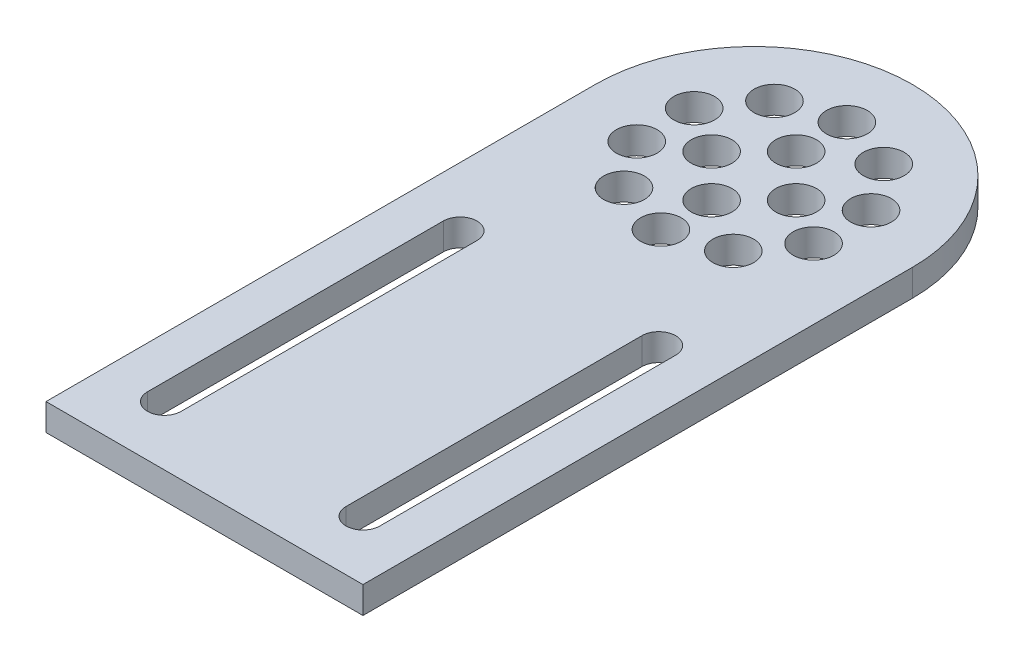
ISO-10303-21;
HEADER;
FILE_DESCRIPTION(('STEP AP214'),'2;1');
FILE_NAME('part.step','',(''),(''),'','','');
FILE_SCHEMA(('AUTOMOTIVE_DESIGN { 1 0 10303 214 1 1 1 1 }'));
ENDSEC;
DATA;
#1=APPLICATION_CONTEXT('core data for automotive mechanical design processes');
#2=APPLICATION_PROTOCOL_DEFINITION('international standard','automotive_design',2000,#1);
#3=PRODUCT_CONTEXT('',#1,'mechanical');
#4=PRODUCT('Part','Part','',(#3));
#5=PRODUCT_RELATED_PRODUCT_CATEGORY('part','',(#4));
#6=PRODUCT_DEFINITION_FORMATION('','',#4);
#7=PRODUCT_DEFINITION_CONTEXT('part definition',#1,'design');
#8=PRODUCT_DEFINITION('design','',#6,#7);
#9=PRODUCT_DEFINITION_SHAPE('','',#8);
#10=(LENGTH_UNIT() NAMED_UNIT(*) SI_UNIT(.MILLI.,.METRE.));
#11=(NAMED_UNIT(*) PLANE_ANGLE_UNIT() SI_UNIT($,.RADIAN.));
#12=(NAMED_UNIT(*) SI_UNIT($,.STERADIAN.) SOLID_ANGLE_UNIT());
#13=UNCERTAINTY_MEASURE_WITH_UNIT(LENGTH_MEASURE(1.E-05),#10,'distance_accuracy_value','');
#14=(GEOMETRIC_REPRESENTATION_CONTEXT(3) GLOBAL_UNCERTAINTY_ASSIGNED_CONTEXT((#13)) GLOBAL_UNIT_ASSIGNED_CONTEXT((#10,
#11,#12)) REPRESENTATION_CONTEXT('',''));
#15=CARTESIAN_POINT('',(0.,0.,0.));
#16=DIRECTION('',(0.,0.,1.));
#17=DIRECTION('',(1.,0.,0.));
#18=AXIS2_PLACEMENT_3D('',#15,#16,#17);
#19=CARTESIAN_POINT('',(0.,6.35,0.));
#20=DIRECTION('',(0.,1.,0.));
#21=DIRECTION('',(0.,0.,1.));
#22=AXIS2_PLACEMENT_3D('',#19,#20,#21);
#23=PLANE('',#22);
#24=CARTESIAN_POINT('',(-23.5,6.35,116.));
#25=DIRECTION('',(0.,1.,0.));
#26=DIRECTION('',(0.,0.,1.));
#27=AXIS2_PLACEMENT_3D('',#24,#25,#26);
#28=CIRCLE('',#27,4.);
#29=CARTESIAN_POINT('',(-27.5,6.35,116.));
#30=VERTEX_POINT('',#29);
#31=CARTESIAN_POINT('',(-19.5,6.35,116.));
#32=VERTEX_POINT('',#31);
#33=EDGE_CURVE('E170',#30,#32,#28,.T.);
#34=ORIENTED_EDGE('',*,*,#33,.F.);
#35=DIRECTION('',(0.,0.,1.));
#36=VECTOR('',#35,1.);
#37=CARTESIAN_POINT('',(-27.5,6.35,116.));
#38=LINE('',#37,#36);
#39=CARTESIAN_POINT('',(-27.5,6.35,46.));
#40=VERTEX_POINT('',#39);
#41=EDGE_CURVE('E181',#40,#30,#38,.T.);
#42=ORIENTED_EDGE('',*,*,#41,.F.);
#43=CARTESIAN_POINT('',(-23.5,6.35,46.));
#44=DIRECTION('',(0.,1.,0.));
#45=DIRECTION('',(0.,0.,1.));
#46=AXIS2_PLACEMENT_3D('',#43,#44,#45);
#47=CIRCLE('',#46,4.00000000000001);
#48=CARTESIAN_POINT('',(-19.5,6.35,46.));
#49=VERTEX_POINT('',#48);
#50=EDGE_CURVE('E200',#49,#40,#47,.T.);
#51=ORIENTED_EDGE('',*,*,#50,.F.);
#52=DIRECTION('',(0.,0.,-1.));
#53=VECTOR('',#52,1.);
#54=CARTESIAN_POINT('',(-19.5,6.35,116.));
#55=LINE('',#54,#53);
#56=EDGE_CURVE('E196',#32,#49,#55,.T.);
#57=ORIENTED_EDGE('',*,*,#56,.F.);
#58=EDGE_LOOP('',(#34,#42,#51,#57));
#59=FACE_BOUND('',#58,.T.);
#60=CARTESIAN_POINT('',(5.84358922609454E-13,6.35,10.));
#61=DIRECTION('',(0.,1.,0.));
#62=DIRECTION('',(0.,0.,1.));
#63=AXIS2_PLACEMENT_3D('',#60,#61,#62);
#64=CIRCLE('',#63,4.825);
#65=CARTESIAN_POINT('',(5.84358922609454E-13,6.35,14.825));
#66=VERTEX_POINT('',#65);
#67=EDGE_CURVE('E228',#66,#66,#64,.T.);
#68=ORIENTED_EDGE('',*,*,#67,.F.);
#69=EDGE_LOOP('',(#68));
#70=FACE_BOUND('',#69,.T.);
#71=CARTESIAN_POINT('',(-12.9312755504338,6.35,-17.7983738762469));
#72=DIRECTION('',(0.,1.,0.));
#73=DIRECTION('',(0.,0.,1.));
#74=AXIS2_PLACEMENT_3D('',#71,#72,#73);
#75=CIRCLE('',#74,4.825);
#76=CARTESIAN_POINT('',(-12.9312755504338,6.35,-12.9733738762469));
#77=VERTEX_POINT('',#76);
#78=EDGE_CURVE('E244',#77,#77,#75,.T.);
#79=ORIENTED_EDGE('',*,*,#78,.F.);
#80=EDGE_LOOP('',(#79));
#81=FACE_BOUND('',#80,.T.);
#82=CARTESIAN_POINT('',(-20.9232433584891,6.35,6.79837387625193));
#83=DIRECTION('',(0.,1.,0.));
#84=DIRECTION('',(0.,0.,1.));
#85=AXIS2_PLACEMENT_3D('',#82,#83,#84);
#86=CIRCLE('',#85,4.825);
#87=CARTESIAN_POINT('',(-20.9232433584891,6.35,11.6233738762519));
#88=VERTEX_POINT('',#87);
#89=EDGE_CURVE('E260',#88,#88,#86,.T.);
#90=ORIENTED_EDGE('',*,*,#89,.F.);
#91=EDGE_LOOP('',(#90));
#92=FACE_BOUND('',#91,.T.);
#93=CARTESIAN_POINT('',(6.48527081483162E-12,6.35,22.));
#94=DIRECTION('',(0.,1.,0.));
#95=DIRECTION('',(0.,0.,1.));
#96=AXIS2_PLACEMENT_3D('',#93,#94,#95);
#97=CIRCLE('',#96,4.825);
#98=CARTESIAN_POINT('',(6.48527081483162E-12,6.35,26.825));
#99=VERTEX_POINT('',#98);
#100=EDGE_CURVE('E276',#99,#99,#97,.T.);
#101=ORIENTED_EDGE('',*,*,#100,.F.);
#102=EDGE_LOOP('',(#101));
#103=FACE_BOUND('',#102,.T.);
#104=CARTESIAN_POINT('',(20.9232433584976,6.35,6.79837387624576));
#105=DIRECTION('',(0.,1.,0.));
#106=DIRECTION('',(0.,0.,1.));
#107=AXIS2_PLACEMENT_3D('',#104,#105,#106);
#108=CIRCLE('',#107,4.825);
#109=CARTESIAN_POINT('',(20.9232433584976,6.35,11.6233738762458));
#110=VERTEX_POINT('',#109);
#111=EDGE_CURVE('E292',#110,#110,#108,.T.);
#112=ORIENTED_EDGE('',*,*,#111,.F.);
#113=EDGE_LOOP('',(#112));
#114=FACE_BOUND('',#113,.T.);
#115=CARTESIAN_POINT('',(12.931275550435,6.35,-17.7983738762507));
#116=DIRECTION('',(0.,1.,0.));
#117=DIRECTION('',(0.,0.,1.));
#118=AXIS2_PLACEMENT_3D('',#115,#116,#117);
#119=CIRCLE('',#118,4.82500000000008);
#120=CARTESIAN_POINT('',(12.931275550435,6.35,-12.9733738762507));
#121=VERTEX_POINT('',#120);
#122=EDGE_CURVE('E308',#121,#121,#119,.T.);
#123=ORIENTED_EDGE('',*,*,#122,.F.);
#124=EDGE_LOOP('',(#123));
#125=FACE_BOUND('',#124,.T.);
#126=CARTESIAN_POINT('',(0.,6.35,-22.));
#127=DIRECTION('',(0.,1.,0.));
#128=DIRECTION('',(0.,0.,1.));
#129=AXIS2_PLACEMENT_3D('',#126,#127,#128);
#130=CIRCLE('',#129,4.825);
#131=CARTESIAN_POINT('',(0.,6.35,-17.175));
#132=VERTEX_POINT('',#131);
#133=EDGE_CURVE('E324',#132,#132,#130,.T.);
#134=ORIENTED_EDGE('',*,*,#133,.F.);
#135=EDGE_LOOP('',(#134));
#136=FACE_BOUND('',#135,.T.);
#137=CARTESIAN_POINT('',(0.,6.35,0.));
#138=DIRECTION('',(0.,1.,0.));
#139=DIRECTION('',(0.,0.,1.));
#140=AXIS2_PLACEMENT_3D('',#137,#138,#139);
#141=CIRCLE('',#140,37.5);
#142=CARTESIAN_POINT('',(37.5,6.35,0.));
#143=VERTEX_POINT('',#142);
#144=CARTESIAN_POINT('',(-37.5,6.35,0.));
#145=VERTEX_POINT('',#144);
#146=EDGE_CURVE('E332',#143,#145,#141,.T.);
#147=ORIENTED_EDGE('',*,*,#146,.T.);
#148=DIRECTION('',(0.,0.,1.));
#149=VECTOR('',#148,1.);
#150=CARTESIAN_POINT('',(-37.5,6.35,0.));
#151=LINE('',#150,#149);
#152=CARTESIAN_POINT('',(-37.5,6.35,130.));
#153=VERTEX_POINT('',#152);
#154=EDGE_CURVE('E336',#145,#153,#151,.T.);
#155=ORIENTED_EDGE('',*,*,#154,.T.);
#156=DIRECTION('',(1.,0.,0.));
#157=VECTOR('',#156,1.);
#158=CARTESIAN_POINT('',(-37.5,6.35,130.));
#159=LINE('',#158,#157);
#160=CARTESIAN_POINT('',(37.5,6.35,130.));
#161=VERTEX_POINT('',#160);
#162=EDGE_CURVE('E340',#153,#161,#159,.T.);
#163=ORIENTED_EDGE('',*,*,#162,.T.);
#164=DIRECTION('',(0.,0.,-1.));
#165=VECTOR('',#164,1.);
#166=CARTESIAN_POINT('',(37.5,6.35,130.));
#167=LINE('',#166,#165);
#168=EDGE_CURVE('E343',#161,#143,#167,.T.);
#169=ORIENTED_EDGE('',*,*,#168,.T.);
#170=EDGE_LOOP('',(#147,#155,#163,#169));
#171=FACE_BOUND('',#170,.T.);
#172=CARTESIAN_POINT('',(0.,6.35,-10.));
#173=DIRECTION('',(0.,1.,0.));
#174=DIRECTION('',(0.,0.,1.));
#175=AXIS2_PLACEMENT_3D('',#172,#173,#174);
#176=CIRCLE('',#175,4.825);
#177=CARTESIAN_POINT('',(0.,6.35,-5.175));
#178=VERTEX_POINT('',#177);
#179=EDGE_CURVE('E316',#178,#178,#176,.T.);
#180=ORIENTED_EDGE('',*,*,#179,.F.);
#181=EDGE_LOOP('',(#180));
#182=FACE_BOUND('',#181,.T.);
#183=CARTESIAN_POINT('',(20.9232433584956,6.35,-6.79837387625193));
#184=DIRECTION('',(0.,1.,0.));
#185=DIRECTION('',(0.,0.,1.));
#186=AXIS2_PLACEMENT_3D('',#183,#184,#185);
#187=CIRCLE('',#186,4.825);
#188=CARTESIAN_POINT('',(20.9232433584956,6.35,-1.97337387625193));
#189=VERTEX_POINT('',#188);
#190=EDGE_CURVE('E300',#189,#189,#187,.T.);
#191=ORIENTED_EDGE('',*,*,#190,.F.);
#192=EDGE_LOOP('',(#191));
#193=FACE_BOUND('',#192,.T.);
#194=CARTESIAN_POINT('',(12.9312755504403,6.35,17.7983738762469));
#195=DIRECTION('',(0.,1.,0.));
#196=DIRECTION('',(0.,0.,1.));
#197=AXIS2_PLACEMENT_3D('',#194,#195,#196);
#198=CIRCLE('',#197,4.825);
#199=CARTESIAN_POINT('',(12.9312755504403,6.35,22.6233738762469));
#200=VERTEX_POINT('',#199);
#201=EDGE_CURVE('E284',#200,#200,#198,.T.);
#202=ORIENTED_EDGE('',*,*,#201,.F.);
#203=EDGE_LOOP('',(#202));
#204=FACE_BOUND('',#203,.T.);
#205=CARTESIAN_POINT('',(-12.9312755504285,6.35,17.7983738762508));
#206=DIRECTION('',(0.,1.,0.));
#207=DIRECTION('',(0.,0.,1.));
#208=AXIS2_PLACEMENT_3D('',#205,#206,#207);
#209=CIRCLE('',#208,4.825);
#210=CARTESIAN_POINT('',(-12.9312755504285,6.35,22.6233738762508));
#211=VERTEX_POINT('',#210);
#212=EDGE_CURVE('E268',#211,#211,#209,.T.);
#213=ORIENTED_EDGE('',*,*,#212,.F.);
#214=EDGE_LOOP('',(#213));
#215=FACE_BOUND('',#214,.T.);
#216=CARTESIAN_POINT('',(-20.9232433584911,6.35,-6.79837387624576));
#217=DIRECTION('',(0.,1.,0.));
#218=DIRECTION('',(0.,0.,1.));
#219=AXIS2_PLACEMENT_3D('',#216,#217,#218);
#220=CIRCLE('',#219,4.825);
#221=CARTESIAN_POINT('',(-20.9232433584911,6.35,-1.97337387624576));
#222=VERTEX_POINT('',#221);
#223=EDGE_CURVE('E252',#222,#222,#220,.T.);
#224=ORIENTED_EDGE('',*,*,#223,.F.);
#225=EDGE_LOOP('',(#224));
#226=FACE_BOUND('',#225,.T.);
#227=CARTESIAN_POINT('',(10.0000000000003,6.35,-2.92179461304727E-13));
#228=DIRECTION('',(0.,1.,0.));
#229=DIRECTION('',(0.,0.,1.));
#230=AXIS2_PLACEMENT_3D('',#227,#228,#229);
#231=CIRCLE('',#230,4.825);
#232=CARTESIAN_POINT('',(10.0000000000003,6.35,4.82499999999971));
#233=VERTEX_POINT('',#232);
#234=EDGE_CURVE('E236',#233,#233,#231,.T.);
#235=ORIENTED_EDGE('',*,*,#234,.F.);
#236=EDGE_LOOP('',(#235));
#237=FACE_BOUND('',#236,.T.);
#238=CARTESIAN_POINT('',(-9.99999999999971,6.35,2.93404108103874E-13));
#239=DIRECTION('',(0.,1.,0.));
#240=DIRECTION('',(0.,0.,1.));
#241=AXIS2_PLACEMENT_3D('',#238,#239,#240);
#242=CIRCLE('',#241,4.825);
#243=CARTESIAN_POINT('',(-9.99999999999971,6.35,4.82500000000029));
#244=VERTEX_POINT('',#243);
#245=EDGE_CURVE('E220',#244,#244,#242,.T.);
#246=ORIENTED_EDGE('',*,*,#245,.F.);
#247=EDGE_LOOP('',(#246));
#248=FACE_BOUND('',#247,.T.);
#249=DIRECTION('',(0.,0.,1.));
#250=VECTOR('',#249,1.);
#251=CARTESIAN_POINT('',(27.5,6.35,116.));
#252=LINE('',#251,#250);
#253=CARTESIAN_POINT('',(27.5,6.35,46.));
#254=VERTEX_POINT('',#253);
#255=CARTESIAN_POINT('',(27.5,6.35,116.));
#256=VERTEX_POINT('',#255);
#257=EDGE_CURVE('E161',#254,#256,#252,.T.);
#258=ORIENTED_EDGE('',*,*,#257,.T.);
#259=CARTESIAN_POINT('',(23.5,6.35,116.));
#260=DIRECTION('',(0.,-1.,0.));
#261=DIRECTION('',(0.,0.,1.));
#262=AXIS2_PLACEMENT_3D('',#259,#260,#261);
#263=CIRCLE('',#262,4.);
#264=CARTESIAN_POINT('',(19.5,6.35,116.));
#265=VERTEX_POINT('',#264);
#266=EDGE_CURVE('E55',#256,#265,#263,.T.);
#267=ORIENTED_EDGE('',*,*,#266,.T.);
#268=DIRECTION('',(0.,0.,-1.));
#269=VECTOR('',#268,1.);
#270=CARTESIAN_POINT('',(19.5,6.35,116.));
#271=LINE('',#270,#269);
#272=CARTESIAN_POINT('',(19.5,6.35,46.));
#273=VERTEX_POINT('',#272);
#274=EDGE_CURVE('E148',#265,#273,#271,.T.);
#275=ORIENTED_EDGE('',*,*,#274,.T.);
#276=CARTESIAN_POINT('',(23.5,6.35,46.));
#277=DIRECTION('',(0.,-1.,0.));
#278=DIRECTION('',(0.,0.,1.));
#279=AXIS2_PLACEMENT_3D('',#276,#277,#278);
#280=CIRCLE('',#279,4.00000000000001);
#281=EDGE_CURVE('E152',#273,#254,#280,.T.);
#282=ORIENTED_EDGE('',*,*,#281,.T.);
#283=EDGE_LOOP('',(#258,#267,#275,#282));
#284=FACE_BOUND('',#283,.T.);
#285=ADVANCED_FACE('F39',(#59,#70,#81,#92,#103,#114,#125,#136,#171,#182,#193,#204,#215,#226,
#237,#248,#284),#23,.T.);
#286=CARTESIAN_POINT('',(0.,0.,0.));
#287=DIRECTION('',(0.,1.,0.));
#288=DIRECTION('',(0.,0.,1.));
#289=AXIS2_PLACEMENT_3D('',#286,#287,#288);
#290=PLANE('',#289);
#291=CARTESIAN_POINT('',(-9.99999999999971,0.,2.93404108103874E-13));
#292=DIRECTION('',(0.,1.,0.));
#293=DIRECTION('',(0.,0.,1.));
#294=AXIS2_PLACEMENT_3D('',#291,#292,#293);
#295=CIRCLE('',#294,4.825);
#296=CARTESIAN_POINT('',(-9.99999999999971,0.,4.82500000000029));
#297=VERTEX_POINT('',#296);
#298=EDGE_CURVE('E210',#297,#297,#295,.T.);
#299=ORIENTED_EDGE('',*,*,#298,.T.);
#300=EDGE_LOOP('',(#299));
#301=FACE_BOUND('',#300,.T.);
#302=CARTESIAN_POINT('',(5.84358922609454E-13,0.,10.));
#303=DIRECTION('',(0.,1.,0.));
#304=DIRECTION('',(0.,0.,1.));
#305=AXIS2_PLACEMENT_3D('',#302,#303,#304);
#306=CIRCLE('',#305,4.825);
#307=CARTESIAN_POINT('',(5.84358922609454E-13,0.,14.825));
#308=VERTEX_POINT('',#307);
#309=EDGE_CURVE('E224',#308,#308,#306,.T.);
#310=ORIENTED_EDGE('',*,*,#309,.T.);
#311=EDGE_LOOP('',(#310));
#312=FACE_BOUND('',#311,.T.);
#313=CARTESIAN_POINT('',(10.0000000000003,0.,-2.92179461304727E-13));
#314=DIRECTION('',(0.,1.,0.));
#315=DIRECTION('',(0.,0.,1.));
#316=AXIS2_PLACEMENT_3D('',#313,#314,#315);
#317=CIRCLE('',#316,4.825);
#318=CARTESIAN_POINT('',(10.0000000000003,0.,4.82499999999971));
#319=VERTEX_POINT('',#318);
#320=EDGE_CURVE('E232',#319,#319,#317,.T.);
#321=ORIENTED_EDGE('',*,*,#320,.T.);
#322=EDGE_LOOP('',(#321));
#323=FACE_BOUND('',#322,.T.);
#324=CARTESIAN_POINT('',(-12.9312755504338,0.,-17.7983738762469));
#325=DIRECTION('',(0.,1.,0.));
#326=DIRECTION('',(0.,0.,1.));
#327=AXIS2_PLACEMENT_3D('',#324,#325,#326);
#328=CIRCLE('',#327,4.825);
#329=CARTESIAN_POINT('',(-12.9312755504338,0.,-12.9733738762469));
#330=VERTEX_POINT('',#329);
#331=EDGE_CURVE('E240',#330,#330,#328,.T.);
#332=ORIENTED_EDGE('',*,*,#331,.T.);
#333=EDGE_LOOP('',(#332));
#334=FACE_BOUND('',#333,.T.);
#335=CARTESIAN_POINT('',(-20.9232433584911,0.,-6.79837387624576));
#336=DIRECTION('',(0.,1.,0.));
#337=DIRECTION('',(0.,0.,1.));
#338=AXIS2_PLACEMENT_3D('',#335,#336,#337);
#339=CIRCLE('',#338,4.825);
#340=CARTESIAN_POINT('',(-20.9232433584911,0.,-1.97337387624576));
#341=VERTEX_POINT('',#340);
#342=EDGE_CURVE('E248',#341,#341,#339,.T.);
#343=ORIENTED_EDGE('',*,*,#342,.T.);
#344=EDGE_LOOP('',(#343));
#345=FACE_BOUND('',#344,.T.);
#346=CARTESIAN_POINT('',(-20.9232433584891,0.,6.79837387625193));
#347=DIRECTION('',(0.,1.,0.));
#348=DIRECTION('',(0.,0.,1.));
#349=AXIS2_PLACEMENT_3D('',#346,#347,#348);
#350=CIRCLE('',#349,4.825);
#351=CARTESIAN_POINT('',(-20.9232433584891,0.,11.6233738762519));
#352=VERTEX_POINT('',#351);
#353=EDGE_CURVE('E256',#352,#352,#350,.T.);
#354=ORIENTED_EDGE('',*,*,#353,.T.);
#355=EDGE_LOOP('',(#354));
#356=FACE_BOUND('',#355,.T.);
#357=CARTESIAN_POINT('',(-12.9312755504285,0.,17.7983738762508));
#358=DIRECTION('',(0.,1.,0.));
#359=DIRECTION('',(0.,0.,1.));
#360=AXIS2_PLACEMENT_3D('',#357,#358,#359);
#361=CIRCLE('',#360,4.825);
#362=CARTESIAN_POINT('',(-12.9312755504285,0.,22.6233738762508));
#363=VERTEX_POINT('',#362);
#364=EDGE_CURVE('E264',#363,#363,#361,.T.);
#365=ORIENTED_EDGE('',*,*,#364,.T.);
#366=EDGE_LOOP('',(#365));
#367=FACE_BOUND('',#366,.T.);
#368=CARTESIAN_POINT('',(6.48527081483162E-12,0.,22.));
#369=DIRECTION('',(0.,1.,0.));
#370=DIRECTION('',(0.,0.,1.));
#371=AXIS2_PLACEMENT_3D('',#368,#369,#370);
#372=CIRCLE('',#371,4.825);
#373=CARTESIAN_POINT('',(6.48527081483162E-12,0.,26.825));
#374=VERTEX_POINT('',#373);
#375=EDGE_CURVE('E272',#374,#374,#372,.T.);
#376=ORIENTED_EDGE('',*,*,#375,.T.);
#377=EDGE_LOOP('',(#376));
#378=FACE_BOUND('',#377,.T.);
#379=CARTESIAN_POINT('',(12.9312755504403,0.,17.7983738762469));
#380=DIRECTION('',(0.,1.,0.));
#381=DIRECTION('',(0.,0.,1.));
#382=AXIS2_PLACEMENT_3D('',#379,#380,#381);
#383=CIRCLE('',#382,4.825);
#384=CARTESIAN_POINT('',(12.9312755504403,0.,22.6233738762469));
#385=VERTEX_POINT('',#384);
#386=EDGE_CURVE('E280',#385,#385,#383,.T.);
#387=ORIENTED_EDGE('',*,*,#386,.T.);
#388=EDGE_LOOP('',(#387));
#389=FACE_BOUND('',#388,.T.);
#390=CARTESIAN_POINT('',(20.9232433584976,0.,6.79837387624576));
#391=DIRECTION('',(0.,1.,0.));
#392=DIRECTION('',(0.,0.,1.));
#393=AXIS2_PLACEMENT_3D('',#390,#391,#392);
#394=CIRCLE('',#393,4.825);
#395=CARTESIAN_POINT('',(20.9232433584976,0.,11.6233738762458));
#396=VERTEX_POINT('',#395);
#397=EDGE_CURVE('E288',#396,#396,#394,.T.);
#398=ORIENTED_EDGE('',*,*,#397,.T.);
#399=EDGE_LOOP('',(#398));
#400=FACE_BOUND('',#399,.T.);
#401=CARTESIAN_POINT('',(20.9232433584956,0.,-6.79837387625193));
#402=DIRECTION('',(0.,1.,0.));
#403=DIRECTION('',(0.,0.,1.));
#404=AXIS2_PLACEMENT_3D('',#401,#402,#403);
#405=CIRCLE('',#404,4.825);
#406=CARTESIAN_POINT('',(20.9232433584956,0.,-1.97337387625193));
#407=VERTEX_POINT('',#406);
#408=EDGE_CURVE('E296',#407,#407,#405,.T.);
#409=ORIENTED_EDGE('',*,*,#408,.T.);
#410=EDGE_LOOP('',(#409));
#411=FACE_BOUND('',#410,.T.);
#412=CARTESIAN_POINT('',(12.931275550435,0.,-17.7983738762507));
#413=DIRECTION('',(0.,1.,0.));
#414=DIRECTION('',(0.,0.,1.));
#415=AXIS2_PLACEMENT_3D('',#412,#413,#414);
#416=CIRCLE('',#415,4.82500000000008);
#417=CARTESIAN_POINT('',(12.931275550435,0.,-12.9733738762507));
#418=VERTEX_POINT('',#417);
#419=EDGE_CURVE('E304',#418,#418,#416,.T.);
#420=ORIENTED_EDGE('',*,*,#419,.T.);
#421=EDGE_LOOP('',(#420));
#422=FACE_BOUND('',#421,.T.);
#423=CARTESIAN_POINT('',(0.,0.,-10.));
#424=DIRECTION('',(0.,1.,0.));
#425=DIRECTION('',(0.,0.,1.));
#426=AXIS2_PLACEMENT_3D('',#423,#424,#425);
#427=CIRCLE('',#426,4.825);
#428=CARTESIAN_POINT('',(0.,0.,-5.175));
#429=VERTEX_POINT('',#428);
#430=EDGE_CURVE('E312',#429,#429,#427,.T.);
#431=ORIENTED_EDGE('',*,*,#430,.T.);
#432=EDGE_LOOP('',(#431));
#433=FACE_BOUND('',#432,.T.);
#434=CARTESIAN_POINT('',(0.,0.,-22.));
#435=DIRECTION('',(0.,1.,0.));
#436=DIRECTION('',(0.,0.,1.));
#437=AXIS2_PLACEMENT_3D('',#434,#435,#436);
#438=CIRCLE('',#437,4.825);
#439=CARTESIAN_POINT('',(0.,0.,-17.175));
#440=VERTEX_POINT('',#439);
#441=EDGE_CURVE('E320',#440,#440,#438,.T.);
#442=ORIENTED_EDGE('',*,*,#441,.T.);
#443=EDGE_LOOP('',(#442));
#444=FACE_BOUND('',#443,.T.);
#445=CARTESIAN_POINT('',(0.,0.,0.));
#446=DIRECTION('',(0.,1.,0.));
#447=DIRECTION('',(0.,0.,1.));
#448=AXIS2_PLACEMENT_3D('',#445,#446,#447);
#449=CIRCLE('',#448,37.5);
#450=CARTESIAN_POINT('',(37.5,0.,0.));
#451=VERTEX_POINT('',#450);
#452=CARTESIAN_POINT('',(-37.5,0.,0.));
#453=VERTEX_POINT('',#452);
#454=EDGE_CURVE('E328',#451,#453,#449,.T.);
#455=ORIENTED_EDGE('',*,*,#454,.F.);
#456=DIRECTION('',(0.,0.,-1.));
#457=VECTOR('',#456,1.);
#458=CARTESIAN_POINT('',(37.5,0.,130.));
#459=LINE('',#458,#457);
#460=CARTESIAN_POINT('',(37.5,0.,130.));
#461=VERTEX_POINT('',#460);
#462=EDGE_CURVE('E337',#461,#451,#459,.T.);
#463=ORIENTED_EDGE('',*,*,#462,.F.);
#464=DIRECTION('',(1.,0.,0.));
#465=VECTOR('',#464,1.);
#466=CARTESIAN_POINT('',(-37.5,0.,130.));
#467=LINE('',#466,#465);
#468=CARTESIAN_POINT('',(-37.5,0.,130.));
#469=VERTEX_POINT('',#468);
#470=EDGE_CURVE('E353',#469,#461,#467,.T.);
#471=ORIENTED_EDGE('',*,*,#470,.F.);
#472=DIRECTION('',(0.,0.,1.));
#473=VECTOR('',#472,1.);
#474=CARTESIAN_POINT('',(-37.5,0.,0.));
#475=LINE('',#474,#473);
#476=EDGE_CURVE('E350',#453,#469,#475,.T.);
#477=ORIENTED_EDGE('',*,*,#476,.F.);
#478=EDGE_LOOP('',(#455,#463,#471,#477));
#479=FACE_BOUND('',#478,.T.);
#480=DIRECTION('',(0.,0.,1.));
#481=VECTOR('',#480,1.);
#482=CARTESIAN_POINT('',(-27.5,0.,116.));
#483=LINE('',#482,#481);
#484=CARTESIAN_POINT('',(-27.5,0.,46.));
#485=VERTEX_POINT('',#484);
#486=CARTESIAN_POINT('',(-27.5,0.,116.));
#487=VERTEX_POINT('',#486);
#488=EDGE_CURVE('E189',#485,#487,#483,.T.);
#489=ORIENTED_EDGE('',*,*,#488,.T.);
#490=CARTESIAN_POINT('',(-23.5,0.,116.));
#491=DIRECTION('',(0.,1.,0.));
#492=DIRECTION('',(0.,0.,1.));
#493=AXIS2_PLACEMENT_3D('',#490,#491,#492);
#494=CIRCLE('',#493,4.);
#495=CARTESIAN_POINT('',(-19.5,0.,116.));
#496=VERTEX_POINT('',#495);
#497=EDGE_CURVE('E176',#487,#496,#494,.T.);
#498=ORIENTED_EDGE('',*,*,#497,.T.);
#499=DIRECTION('',(0.,0.,-1.));
#500=VECTOR('',#499,1.);
#501=CARTESIAN_POINT('',(-19.5,0.,116.));
#502=LINE('',#501,#500);
#503=CARTESIAN_POINT('',(-19.5,0.,46.));
#504=VERTEX_POINT('',#503);
#505=EDGE_CURVE('E180',#496,#504,#502,.T.);
#506=ORIENTED_EDGE('',*,*,#505,.T.);
#507=CARTESIAN_POINT('',(-23.5,0.,46.));
#508=DIRECTION('',(0.,1.,0.));
#509=DIRECTION('',(0.,0.,1.));
#510=AXIS2_PLACEMENT_3D('',#507,#508,#509);
#511=CIRCLE('',#510,4.00000000000001);
#512=EDGE_CURVE('E185',#504,#485,#511,.T.);
#513=ORIENTED_EDGE('',*,*,#512,.T.);
#514=EDGE_LOOP('',(#489,#498,#506,#513));
#515=FACE_BOUND('',#514,.T.);
#516=CARTESIAN_POINT('',(23.5,0.,116.));
#517=DIRECTION('',(0.,-1.,0.));
#518=DIRECTION('',(0.,0.,1.));
#519=AXIS2_PLACEMENT_3D('',#516,#517,#518);
#520=CIRCLE('',#519,4.);
#521=CARTESIAN_POINT('',(27.5,0.,116.));
#522=VERTEX_POINT('',#521);
#523=CARTESIAN_POINT('',(19.5,0.,116.));
#524=VERTEX_POINT('',#523);
#525=EDGE_CURVE('E138',#522,#524,#520,.T.);
#526=ORIENTED_EDGE('',*,*,#525,.F.);
#527=DIRECTION('',(0.,0.,1.));
#528=VECTOR('',#527,1.);
#529=CARTESIAN_POINT('',(27.5,0.,116.));
#530=LINE('',#529,#528);
#531=CARTESIAN_POINT('',(27.5,0.,46.));
#532=VERTEX_POINT('',#531);
#533=EDGE_CURVE('E129',#532,#522,#530,.T.);
#534=ORIENTED_EDGE('',*,*,#533,.F.);
#535=CARTESIAN_POINT('',(23.5,0.,46.));
#536=DIRECTION('',(0.,-1.,0.));
#537=DIRECTION('',(0.,0.,1.));
#538=AXIS2_PLACEMENT_3D('',#535,#536,#537);
#539=CIRCLE('',#538,4.00000000000001);
#540=CARTESIAN_POINT('',(19.5,0.,46.));
#541=VERTEX_POINT('',#540);
#542=EDGE_CURVE('E137',#541,#532,#539,.T.);
#543=ORIENTED_EDGE('',*,*,#542,.F.);
#544=DIRECTION('',(0.,0.,-1.));
#545=VECTOR('',#544,1.);
#546=CARTESIAN_POINT('',(19.5,0.,116.));
#547=LINE('',#546,#545);
#548=EDGE_CURVE('E143',#524,#541,#547,.T.);
#549=ORIENTED_EDGE('',*,*,#548,.F.);
#550=EDGE_LOOP('',(#526,#534,#543,#549));
#551=FACE_BOUND('',#550,.T.);
#552=ADVANCED_FACE('F146',(#301,#312,#323,#334,#345,#356,#367,#378,#389,#400,#411,#422,#433,
#444,#479,#515,#551),#290,.F.);
#553=CARTESIAN_POINT('',(0.,6.35,0.));
#554=DIRECTION('',(0.,-1.,0.));
#555=DIRECTION('',(0.,0.,-1.));
#556=AXIS2_PLACEMENT_3D('',#553,#554,#555);
#557=CYLINDRICAL_SURFACE('',#556,37.5);
#558=ORIENTED_EDGE('',*,*,#454,.T.);
#559=DIRECTION('',(0.,-1.,0.));
#560=VECTOR('',#559,1.);
#561=CARTESIAN_POINT('',(-37.5,6.35,0.));
#562=LINE('',#561,#560);
#563=EDGE_CURVE('E11',#145,#453,#562,.T.);
#564=ORIENTED_EDGE('',*,*,#563,.F.);
#565=ORIENTED_EDGE('',*,*,#146,.F.);
#566=DIRECTION('',(0.,-1.,0.));
#567=VECTOR('',#566,1.);
#568=CARTESIAN_POINT('',(37.5,6.35,0.));
#569=LINE('',#568,#567);
#570=EDGE_CURVE('E346',#143,#451,#569,.T.);
#571=ORIENTED_EDGE('',*,*,#570,.T.);
#572=EDGE_LOOP('',(#558,#564,#565,#571));
#573=FACE_BOUND('',#572,.T.);
#574=ADVANCED_FACE('F41',(#573),#557,.T.);
#575=CARTESIAN_POINT('',(-37.5,6.35,0.));
#576=DIRECTION('',(1.,0.,0.));
#577=DIRECTION('',(0.,0.,-1.));
#578=AXIS2_PLACEMENT_3D('',#575,#576,#577);
#579=PLANE('',#578);
#580=ORIENTED_EDGE('',*,*,#476,.T.);
#581=DIRECTION('',(0.,-1.,0.));
#582=VECTOR('',#581,1.);
#583=CARTESIAN_POINT('',(-37.5,6.35,130.));
#584=LINE('',#583,#582);
#585=EDGE_CURVE('E48',#153,#469,#584,.T.);
#586=ORIENTED_EDGE('',*,*,#585,.F.);
#587=ORIENTED_EDGE('',*,*,#154,.F.);
#588=ORIENTED_EDGE('',*,*,#563,.T.);
#589=EDGE_LOOP('',(#580,#586,#587,#588));
#590=FACE_BOUND('',#589,.T.);
#591=ADVANCED_FACE('F386',(#590),#579,.F.);
#592=CARTESIAN_POINT('',(-37.5,6.35,130.));
#593=DIRECTION('',(0.,0.,-1.));
#594=DIRECTION('',(-1.,0.,0.));
#595=AXIS2_PLACEMENT_3D('',#592,#593,#594);
#596=PLANE('',#595);
#597=ORIENTED_EDGE('',*,*,#470,.T.);
#598=DIRECTION('',(0.,-1.,0.));
#599=VECTOR('',#598,1.);
#600=CARTESIAN_POINT('',(37.5,6.35,130.));
#601=LINE('',#600,#599);
#602=EDGE_CURVE('E361',#161,#461,#601,.T.);
#603=ORIENTED_EDGE('',*,*,#602,.F.);
#604=ORIENTED_EDGE('',*,*,#162,.F.);
#605=ORIENTED_EDGE('',*,*,#585,.T.);
#606=EDGE_LOOP('',(#597,#603,#604,#605));
#607=FACE_BOUND('',#606,.T.);
#608=ADVANCED_FACE('F370',(#607),#596,.F.);
#609=CARTESIAN_POINT('',(37.5,6.35,130.));
#610=DIRECTION('',(-1.,0.,0.));
#611=DIRECTION('',(0.,0.,1.));
#612=AXIS2_PLACEMENT_3D('',#609,#610,#611);
#613=PLANE('',#612);
#614=ORIENTED_EDGE('',*,*,#462,.T.);
#615=ORIENTED_EDGE('',*,*,#570,.F.);
#616=ORIENTED_EDGE('',*,*,#168,.F.);
#617=ORIENTED_EDGE('',*,*,#602,.T.);
#618=EDGE_LOOP('',(#614,#615,#616,#617));
#619=FACE_BOUND('',#618,.T.);
#620=ADVANCED_FACE('F379',(#619),#613,.F.);
#621=CARTESIAN_POINT('',(0.,6.35,-22.));
#622=DIRECTION('',(0.,-1.,0.));
#623=DIRECTION('',(0.,0.,-1.));
#624=AXIS2_PLACEMENT_3D('',#621,#622,#623);
#625=CYLINDRICAL_SURFACE('',#624,4.825);
#626=ORIENTED_EDGE('',*,*,#133,.T.);
#627=EDGE_LOOP('',(#626));
#628=FACE_BOUND('',#627,.T.);
#629=ORIENTED_EDGE('',*,*,#441,.F.);
#630=EDGE_LOOP('',(#629));
#631=FACE_BOUND('',#630,.T.);
#632=ADVANCED_FACE('F404',(#628,#631),#625,.F.);
#633=CARTESIAN_POINT('',(0.,6.35,-10.));
#634=DIRECTION('',(0.,-1.,0.));
#635=DIRECTION('',(0.,0.,-1.));
#636=AXIS2_PLACEMENT_3D('',#633,#634,#635);
#637=CYLINDRICAL_SURFACE('',#636,4.825);
#638=ORIENTED_EDGE('',*,*,#179,.T.);
#639=EDGE_LOOP('',(#638));
#640=FACE_BOUND('',#639,.T.);
#641=ORIENTED_EDGE('',*,*,#430,.F.);
#642=EDGE_LOOP('',(#641));
#643=FACE_BOUND('',#642,.T.);
#644=ADVANCED_FACE('F411',(#640,#643),#637,.F.);
#645=CARTESIAN_POINT('',(12.931275550435,6.35,-17.7983738762507));
#646=DIRECTION('',(0.,-1.,0.));
#647=DIRECTION('',(0.,0.,-1.));
#648=AXIS2_PLACEMENT_3D('',#645,#646,#647);
#649=CYLINDRICAL_SURFACE('',#648,4.82500000000008);
#650=ORIENTED_EDGE('',*,*,#122,.T.);
#651=EDGE_LOOP('',(#650));
#652=FACE_BOUND('',#651,.T.);
#653=ORIENTED_EDGE('',*,*,#419,.F.);
#654=EDGE_LOOP('',(#653));
#655=FACE_BOUND('',#654,.T.);
#656=ADVANCED_FACE('F416',(#652,#655),#649,.F.);
#657=CARTESIAN_POINT('',(20.9232433584956,6.35,-6.79837387625193));
#658=DIRECTION('',(0.,-1.,0.));
#659=DIRECTION('',(0.,0.,-1.));
#660=AXIS2_PLACEMENT_3D('',#657,#658,#659);
#661=CYLINDRICAL_SURFACE('',#660,4.825);
#662=ORIENTED_EDGE('',*,*,#190,.T.);
#663=EDGE_LOOP('',(#662));
#664=FACE_BOUND('',#663,.T.);
#665=ORIENTED_EDGE('',*,*,#408,.F.);
#666=EDGE_LOOP('',(#665));
#667=FACE_BOUND('',#666,.T.);
#668=ADVANCED_FACE('F426',(#664,#667),#661,.F.);
#669=CARTESIAN_POINT('',(20.9232433584976,6.35,6.79837387624576));
#670=DIRECTION('',(0.,-1.,0.));
#671=DIRECTION('',(0.,0.,-1.));
#672=AXIS2_PLACEMENT_3D('',#669,#670,#671);
#673=CYLINDRICAL_SURFACE('',#672,4.825);
#674=ORIENTED_EDGE('',*,*,#111,.T.);
#675=EDGE_LOOP('',(#674));
#676=FACE_BOUND('',#675,.T.);
#677=ORIENTED_EDGE('',*,*,#397,.F.);
#678=EDGE_LOOP('',(#677));
#679=FACE_BOUND('',#678,.T.);
#680=ADVANCED_FACE('F433',(#676,#679),#673,.F.);
#681=CARTESIAN_POINT('',(12.9312755504403,6.35,17.7983738762469));
#682=DIRECTION('',(0.,-1.,0.));
#683=DIRECTION('',(0.,0.,-1.));
#684=AXIS2_PLACEMENT_3D('',#681,#682,#683);
#685=CYLINDRICAL_SURFACE('',#684,4.825);
#686=ORIENTED_EDGE('',*,*,#201,.T.);
#687=EDGE_LOOP('',(#686));
#688=FACE_BOUND('',#687,.T.);
#689=ORIENTED_EDGE('',*,*,#386,.F.);
#690=EDGE_LOOP('',(#689));
#691=FACE_BOUND('',#690,.T.);
#692=ADVANCED_FACE('F437',(#688,#691),#685,.F.);
#693=CARTESIAN_POINT('',(6.48527081483162E-12,6.35,22.));
#694=DIRECTION('',(0.,-1.,0.));
#695=DIRECTION('',(0.,0.,-1.));
#696=AXIS2_PLACEMENT_3D('',#693,#694,#695);
#697=CYLINDRICAL_SURFACE('',#696,4.825);
#698=ORIENTED_EDGE('',*,*,#100,.T.);
#699=EDGE_LOOP('',(#698));
#700=FACE_BOUND('',#699,.T.);
#701=ORIENTED_EDGE('',*,*,#375,.F.);
#702=EDGE_LOOP('',(#701));
#703=FACE_BOUND('',#702,.T.);
#704=ADVANCED_FACE('F441',(#700,#703),#697,.F.);
#705=CARTESIAN_POINT('',(-12.9312755504285,6.35,17.7983738762508));
#706=DIRECTION('',(0.,-1.,0.));
#707=DIRECTION('',(0.,0.,-1.));
#708=AXIS2_PLACEMENT_3D('',#705,#706,#707);
#709=CYLINDRICAL_SURFACE('',#708,4.825);
#710=ORIENTED_EDGE('',*,*,#212,.T.);
#711=EDGE_LOOP('',(#710));
#712=FACE_BOUND('',#711,.T.);
#713=ORIENTED_EDGE('',*,*,#364,.F.);
#714=EDGE_LOOP('',(#713));
#715=FACE_BOUND('',#714,.T.);
#716=ADVANCED_FACE('F445',(#712,#715),#709,.F.);
#717=CARTESIAN_POINT('',(-20.9232433584891,6.35,6.79837387625193));
#718=DIRECTION('',(0.,-1.,0.));
#719=DIRECTION('',(0.,0.,-1.));
#720=AXIS2_PLACEMENT_3D('',#717,#718,#719);
#721=CYLINDRICAL_SURFACE('',#720,4.825);
#722=ORIENTED_EDGE('',*,*,#89,.T.);
#723=EDGE_LOOP('',(#722));
#724=FACE_BOUND('',#723,.T.);
#725=ORIENTED_EDGE('',*,*,#353,.F.);
#726=EDGE_LOOP('',(#725));
#727=FACE_BOUND('',#726,.T.);
#728=ADVANCED_FACE('F449',(#724,#727),#721,.F.);
#729=CARTESIAN_POINT('',(-20.9232433584911,6.35,-6.79837387624576));
#730=DIRECTION('',(0.,-1.,0.));
#731=DIRECTION('',(0.,0.,-1.));
#732=AXIS2_PLACEMENT_3D('',#729,#730,#731);
#733=CYLINDRICAL_SURFACE('',#732,4.825);
#734=ORIENTED_EDGE('',*,*,#223,.T.);
#735=EDGE_LOOP('',(#734));
#736=FACE_BOUND('',#735,.T.);
#737=ORIENTED_EDGE('',*,*,#342,.F.);
#738=EDGE_LOOP('',(#737));
#739=FACE_BOUND('',#738,.T.);
#740=ADVANCED_FACE('F453',(#736,#739),#733,.F.);
#741=CARTESIAN_POINT('',(-12.9312755504338,6.35,-17.7983738762469));
#742=DIRECTION('',(0.,-1.,0.));
#743=DIRECTION('',(0.,0.,-1.));
#744=AXIS2_PLACEMENT_3D('',#741,#742,#743);
#745=CYLINDRICAL_SURFACE('',#744,4.825);
#746=ORIENTED_EDGE('',*,*,#78,.T.);
#747=EDGE_LOOP('',(#746));
#748=FACE_BOUND('',#747,.T.);
#749=ORIENTED_EDGE('',*,*,#331,.F.);
#750=EDGE_LOOP('',(#749));
#751=FACE_BOUND('',#750,.T.);
#752=ADVANCED_FACE('F457',(#748,#751),#745,.F.);
#753=CARTESIAN_POINT('',(10.0000000000003,6.35,-2.92179461304727E-13));
#754=DIRECTION('',(0.,-1.,0.));
#755=DIRECTION('',(0.,0.,-1.));
#756=AXIS2_PLACEMENT_3D('',#753,#754,#755);
#757=CYLINDRICAL_SURFACE('',#756,4.825);
#758=ORIENTED_EDGE('',*,*,#234,.T.);
#759=EDGE_LOOP('',(#758));
#760=FACE_BOUND('',#759,.T.);
#761=ORIENTED_EDGE('',*,*,#320,.F.);
#762=EDGE_LOOP('',(#761));
#763=FACE_BOUND('',#762,.T.);
#764=ADVANCED_FACE('F461',(#760,#763),#757,.F.);
#765=CARTESIAN_POINT('',(5.84358922609454E-13,6.35,10.));
#766=DIRECTION('',(0.,-1.,0.));
#767=DIRECTION('',(0.,0.,-1.));
#768=AXIS2_PLACEMENT_3D('',#765,#766,#767);
#769=CYLINDRICAL_SURFACE('',#768,4.825);
#770=ORIENTED_EDGE('',*,*,#67,.T.);
#771=EDGE_LOOP('',(#770));
#772=FACE_BOUND('',#771,.T.);
#773=ORIENTED_EDGE('',*,*,#309,.F.);
#774=EDGE_LOOP('',(#773));
#775=FACE_BOUND('',#774,.T.);
#776=ADVANCED_FACE('F465',(#772,#775),#769,.F.);
#777=CARTESIAN_POINT('',(-9.99999999999971,6.35,2.93404108103874E-13));
#778=DIRECTION('',(0.,-1.,0.));
#779=DIRECTION('',(0.,0.,-1.));
#780=AXIS2_PLACEMENT_3D('',#777,#778,#779);
#781=CYLINDRICAL_SURFACE('',#780,4.825);
#782=ORIENTED_EDGE('',*,*,#245,.T.);
#783=EDGE_LOOP('',(#782));
#784=FACE_BOUND('',#783,.T.);
#785=ORIENTED_EDGE('',*,*,#298,.F.);
#786=EDGE_LOOP('',(#785));
#787=FACE_BOUND('',#786,.T.);
#788=ADVANCED_FACE('F469',(#784,#787),#781,.F.);
#789=CARTESIAN_POINT('',(-23.5,0.,116.));
#790=DIRECTION('',(0.,1.,0.));
#791=DIRECTION('',(0.,0.,1.));
#792=AXIS2_PLACEMENT_3D('',#789,#790,#791);
#793=CYLINDRICAL_SURFACE('',#792,4.);
#794=ORIENTED_EDGE('',*,*,#33,.T.);
#795=DIRECTION('',(0.,1.,0.));
#796=VECTOR('',#795,1.);
#797=CARTESIAN_POINT('',(-19.5,0.,116.));
#798=LINE('',#797,#796);
#799=EDGE_CURVE('E193',#496,#32,#798,.T.);
#800=ORIENTED_EDGE('',*,*,#799,.F.);
#801=ORIENTED_EDGE('',*,*,#497,.F.);
#802=DIRECTION('',(0.,1.,0.));
#803=VECTOR('',#802,1.);
#804=CARTESIAN_POINT('',(-27.5,0.,116.));
#805=LINE('',#804,#803);
#806=EDGE_CURVE('E207',#487,#30,#805,.T.);
#807=ORIENTED_EDGE('',*,*,#806,.T.);
#808=EDGE_LOOP('',(#794,#800,#801,#807));
#809=FACE_BOUND('',#808,.T.);
#810=ADVANCED_FACE('F473',(#809),#793,.F.);
#811=CARTESIAN_POINT('',(-27.5,0.,116.));
#812=DIRECTION('',(-1.,0.,0.));
#813=DIRECTION('',(0.,0.,1.));
#814=AXIS2_PLACEMENT_3D('',#811,#812,#813);
#815=PLANE('',#814);
#816=ORIENTED_EDGE('',*,*,#41,.T.);
#817=ORIENTED_EDGE('',*,*,#806,.F.);
#818=ORIENTED_EDGE('',*,*,#488,.F.);
#819=DIRECTION('',(0.,1.,0.));
#820=VECTOR('',#819,1.);
#821=CARTESIAN_POINT('',(-27.5,0.,46.));
#822=LINE('',#821,#820);
#823=EDGE_CURVE('E211',#485,#40,#822,.T.);
#824=ORIENTED_EDGE('',*,*,#823,.T.);
#825=EDGE_LOOP('',(#816,#817,#818,#824));
#826=FACE_BOUND('',#825,.T.);
#827=ADVANCED_FACE('F477',(#826),#815,.F.);
#828=CARTESIAN_POINT('',(-23.5,0.,46.));
#829=DIRECTION('',(0.,1.,0.));
#830=DIRECTION('',(0.,0.,1.));
#831=AXIS2_PLACEMENT_3D('',#828,#829,#830);
#832=CYLINDRICAL_SURFACE('',#831,4.00000000000001);
#833=ORIENTED_EDGE('',*,*,#50,.T.);
#834=ORIENTED_EDGE('',*,*,#823,.F.);
#835=ORIENTED_EDGE('',*,*,#512,.F.);
#836=DIRECTION('',(0.,1.,0.));
#837=VECTOR('',#836,1.);
#838=CARTESIAN_POINT('',(-19.5,0.,46.));
#839=LINE('',#838,#837);
#840=EDGE_CURVE('E214',#504,#49,#839,.T.);
#841=ORIENTED_EDGE('',*,*,#840,.T.);
#842=EDGE_LOOP('',(#833,#834,#835,#841));
#843=FACE_BOUND('',#842,.T.);
#844=ADVANCED_FACE('F482',(#843),#832,.F.);
#845=CARTESIAN_POINT('',(-19.5,0.,116.));
#846=DIRECTION('',(1.,0.,0.));
#847=DIRECTION('',(0.,0.,-1.));
#848=AXIS2_PLACEMENT_3D('',#845,#846,#847);
#849=PLANE('',#848);
#850=ORIENTED_EDGE('',*,*,#56,.T.);
#851=ORIENTED_EDGE('',*,*,#840,.F.);
#852=ORIENTED_EDGE('',*,*,#505,.F.);
#853=ORIENTED_EDGE('',*,*,#799,.T.);
#854=EDGE_LOOP('',(#850,#851,#852,#853));
#855=FACE_BOUND('',#854,.T.);
#856=ADVANCED_FACE('F479',(#855),#849,.F.);
#857=CARTESIAN_POINT('',(23.5,0.,116.));
#858=DIRECTION('',(0.,1.,0.));
#859=DIRECTION('',(0.,0.,1.));
#860=AXIS2_PLACEMENT_3D('',#857,#858,#859);
#861=CYLINDRICAL_SURFACE('',#860,4.);
#862=ORIENTED_EDGE('',*,*,#266,.F.);
#863=DIRECTION('',(0.,1.,0.));
#864=VECTOR('',#863,1.);
#865=CARTESIAN_POINT('',(27.5,0.,116.));
#866=LINE('',#865,#864);
#867=EDGE_CURVE('E131',#522,#256,#866,.T.);
#868=ORIENTED_EDGE('',*,*,#867,.F.);
#869=ORIENTED_EDGE('',*,*,#525,.T.);
#870=DIRECTION('',(0.,1.,0.));
#871=VECTOR('',#870,1.);
#872=CARTESIAN_POINT('',(19.5,0.,116.));
#873=LINE('',#872,#871);
#874=EDGE_CURVE('E167',#524,#265,#873,.T.);
#875=ORIENTED_EDGE('',*,*,#874,.T.);
#876=EDGE_LOOP('',(#862,#868,#869,#875));
#877=FACE_BOUND('',#876,.T.);
#878=ADVANCED_FACE('F140',(#877),#861,.F.);
#879=CARTESIAN_POINT('',(19.5,0.,116.));
#880=DIRECTION('',(1.,0.,0.));
#881=DIRECTION('',(0.,0.,-1.));
#882=AXIS2_PLACEMENT_3D('',#879,#880,#881);
#883=PLANE('',#882);
#884=ORIENTED_EDGE('',*,*,#274,.F.);
#885=ORIENTED_EDGE('',*,*,#874,.F.);
#886=ORIENTED_EDGE('',*,*,#548,.T.);
#887=DIRECTION('',(0.,1.,0.));
#888=VECTOR('',#887,1.);
#889=CARTESIAN_POINT('',(19.5,0.,46.));
#890=LINE('',#889,#888);
#891=EDGE_CURVE('E171',#541,#273,#890,.T.);
#892=ORIENTED_EDGE('',*,*,#891,.T.);
#893=EDGE_LOOP('',(#884,#885,#886,#892));
#894=FACE_BOUND('',#893,.T.);
#895=ADVANCED_FACE('F492',(#894),#883,.T.);
#896=CARTESIAN_POINT('',(23.5,0.,46.));
#897=DIRECTION('',(0.,1.,0.));
#898=DIRECTION('',(0.,0.,1.));
#899=AXIS2_PLACEMENT_3D('',#896,#897,#898);
#900=CYLINDRICAL_SURFACE('',#899,4.00000000000001);
#901=ORIENTED_EDGE('',*,*,#281,.F.);
#902=ORIENTED_EDGE('',*,*,#891,.F.);
#903=ORIENTED_EDGE('',*,*,#542,.T.);
#904=DIRECTION('',(0.,1.,0.));
#905=VECTOR('',#904,1.);
#906=CARTESIAN_POINT('',(27.5,0.,46.));
#907=LINE('',#906,#905);
#908=EDGE_CURVE('E63',#532,#254,#907,.T.);
#909=ORIENTED_EDGE('',*,*,#908,.T.);
#910=EDGE_LOOP('',(#901,#902,#903,#909));
#911=FACE_BOUND('',#910,.T.);
#912=ADVANCED_FACE('F495',(#911),#900,.F.);
#913=CARTESIAN_POINT('',(27.5,0.,116.));
#914=DIRECTION('',(-1.,0.,0.));
#915=DIRECTION('',(0.,0.,1.));
#916=AXIS2_PLACEMENT_3D('',#913,#914,#915);
#917=PLANE('',#916);
#918=ORIENTED_EDGE('',*,*,#257,.F.);
#919=ORIENTED_EDGE('',*,*,#908,.F.);
#920=ORIENTED_EDGE('',*,*,#533,.T.);
#921=ORIENTED_EDGE('',*,*,#867,.T.);
#922=EDGE_LOOP('',(#918,#919,#920,#921));
#923=FACE_BOUND('',#922,.T.);
#924=ADVANCED_FACE('F130',(#923),#917,.T.);
#925=CLOSED_SHELL('',(#285,#552,#574,#591,#608,#620,#632,#644,#656,#668,#680,#692,#704,#716,
#728,#740,#752,#764,#776,#788,#810,#827,#844,#856,#878,#895,#912,#924));
#926=MANIFOLD_SOLID_BREP('B2',#925);
#927=ADVANCED_BREP_SHAPE_REPRESENTATION('',(#18,#926),#14);
#928=SHAPE_DEFINITION_REPRESENTATION(#9,#927);
ENDSEC;
END-ISO-10303-21;
